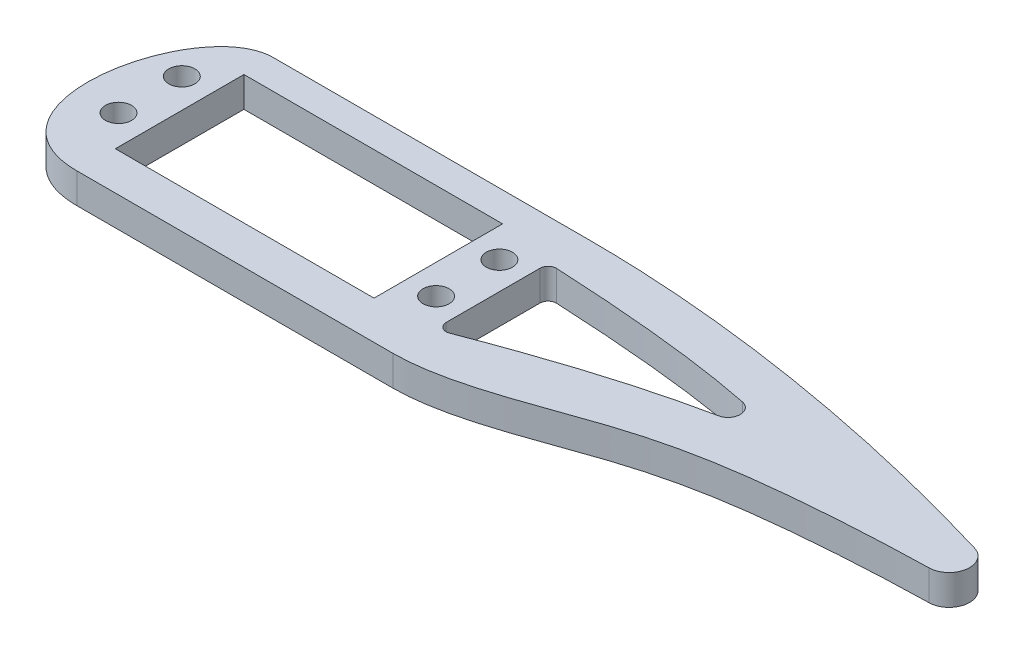
ISO-10303-21;
HEADER;
FILE_DESCRIPTION(('STEP AP214'),'2;1');
FILE_NAME('part.step','',(''),(''),'','','');
FILE_SCHEMA(('AUTOMOTIVE_DESIGN { 1 0 10303 214 1 1 1 1 }'));
ENDSEC;
DATA;
#1=APPLICATION_CONTEXT('core data for automotive mechanical design processes');
#2=APPLICATION_PROTOCOL_DEFINITION('international standard','automotive_design',2000,#1);
#3=PRODUCT_CONTEXT('',#1,'mechanical');
#4=PRODUCT('Part','Part','',(#3));
#5=PRODUCT_RELATED_PRODUCT_CATEGORY('part','',(#4));
#6=PRODUCT_DEFINITION_FORMATION('','',#4);
#7=PRODUCT_DEFINITION_CONTEXT('part definition',#1,'design');
#8=PRODUCT_DEFINITION('design','',#6,#7);
#9=PRODUCT_DEFINITION_SHAPE('','',#8);
#10=(LENGTH_UNIT() NAMED_UNIT(*) SI_UNIT(.MILLI.,.METRE.));
#11=(NAMED_UNIT(*) PLANE_ANGLE_UNIT() SI_UNIT($,.RADIAN.));
#12=(NAMED_UNIT(*) SI_UNIT($,.STERADIAN.) SOLID_ANGLE_UNIT());
#13=UNCERTAINTY_MEASURE_WITH_UNIT(LENGTH_MEASURE(1.E-05),#10,'distance_accuracy_value','');
#14=(GEOMETRIC_REPRESENTATION_CONTEXT(3) GLOBAL_UNCERTAINTY_ASSIGNED_CONTEXT((#13)) GLOBAL_UNIT_ASSIGNED_CONTEXT((#10,
#11,#12)) REPRESENTATION_CONTEXT('',''));
#15=CARTESIAN_POINT('',(0.,0.,0.));
#16=DIRECTION('',(0.,0.,1.));
#17=DIRECTION('',(1.,0.,0.));
#18=AXIS2_PLACEMENT_3D('',#15,#16,#17);
#19=CARTESIAN_POINT('',(74.0585037098222,4.699,-9.69738823326125));
#20=DIRECTION('',(0.,1.,0.));
#21=DIRECTION('',(0.,0.,1.));
#22=AXIS2_PLACEMENT_3D('',#19,#20,#21);
#23=PLANE('',#22);
#24=CARTESIAN_POINT('',(24.71166,4.699,4.92506));
#25=DIRECTION('',(0.,1.,0.));
#26=DIRECTION('',(0.,0.,1.));
#27=AXIS2_PLACEMENT_3D('',#24,#25,#26);
#28=CIRCLE('',#27,2.032);
#29=CARTESIAN_POINT('',(24.71166,4.699,6.95706));
#30=VERTEX_POINT('',#29);
#31=EDGE_CURVE('E184',#30,#30,#28,.T.);
#32=ORIENTED_EDGE('',*,*,#31,.F.);
#33=EDGE_LOOP('',(#32));
#34=FACE_BOUND('',#33,.T.);
#35=CARTESIAN_POINT('',(-24.71166,4.699,4.92506));
#36=DIRECTION('',(0.,1.,0.));
#37=DIRECTION('',(0.,0.,1.));
#38=AXIS2_PLACEMENT_3D('',#35,#36,#37);
#39=CIRCLE('',#38,2.032);
#40=CARTESIAN_POINT('',(-24.71166,4.699,6.95706));
#41=VERTEX_POINT('',#40);
#42=EDGE_CURVE('E396',#41,#41,#39,.T.);
#43=ORIENTED_EDGE('',*,*,#42,.F.);
#44=EDGE_LOOP('',(#43));
#45=FACE_BOUND('',#44,.T.);
#46=CARTESIAN_POINT('',(-24.71166,4.699,-4.92506));
#47=DIRECTION('',(0.,1.,0.));
#48=DIRECTION('',(0.,0.,1.));
#49=AXIS2_PLACEMENT_3D('',#46,#47,#48);
#50=CIRCLE('',#49,2.032);
#51=CARTESIAN_POINT('',(-24.71166,4.699,-2.89306));
#52=VERTEX_POINT('',#51);
#53=EDGE_CURVE('E395',#52,#52,#50,.T.);
#54=ORIENTED_EDGE('',*,*,#53,.F.);
#55=EDGE_LOOP('',(#54));
#56=FACE_BOUND('',#55,.T.);
#57=CARTESIAN_POINT('',(24.71166,4.699,-4.92506));
#58=DIRECTION('',(0.,1.,0.));
#59=DIRECTION('',(0.,0.,1.));
#60=AXIS2_PLACEMENT_3D('',#57,#58,#59);
#61=CIRCLE('',#60,2.032);
#62=CARTESIAN_POINT('',(24.71166,4.699,-2.89306));
#63=VERTEX_POINT('',#62);
#64=EDGE_CURVE('E385',#63,#63,#61,.T.);
#65=ORIENTED_EDGE('',*,*,#64,.F.);
#66=EDGE_LOOP('',(#65));
#67=FACE_BOUND('',#66,.T.);
#68=DIRECTION('',(1.,0.,0.));
#69=VECTOR('',#68,1.);
#70=CARTESIAN_POINT('',(0.,4.699,10.0076));
#71=LINE('',#70,#69);
#72=CARTESIAN_POINT('',(-20.1295,4.699,10.0076));
#73=VERTEX_POINT('',#72);
#74=CARTESIAN_POINT('',(20.1295,4.699,10.0076));
#75=VERTEX_POINT('',#74);
#76=EDGE_CURVE('E414',#73,#75,#71,.T.);
#77=ORIENTED_EDGE('',*,*,#76,.F.);
#78=DIRECTION('',(0.,0.,-1.));
#79=VECTOR('',#78,1.);
#80=CARTESIAN_POINT('',(-20.1295,4.699,0.));
#81=LINE('',#80,#79);
#82=CARTESIAN_POINT('',(-20.1295,4.699,-10.0076));
#83=VERTEX_POINT('',#82);
#84=EDGE_CURVE('E417',#73,#83,#81,.T.);
#85=ORIENTED_EDGE('',*,*,#84,.T.);
#86=DIRECTION('',(1.,0.,0.));
#87=VECTOR('',#86,1.);
#88=CARTESIAN_POINT('',(0.,4.699,-10.0076));
#89=LINE('',#88,#87);
#90=CARTESIAN_POINT('',(20.1295,4.699,-10.0076));
#91=VERTEX_POINT('',#90);
#92=EDGE_CURVE('E422',#83,#91,#89,.T.);
#93=ORIENTED_EDGE('',*,*,#92,.T.);
#94=DIRECTION('',(0.,0.,-1.));
#95=VECTOR('',#94,1.);
#96=CARTESIAN_POINT('',(20.1295,4.699,0.));
#97=LINE('',#96,#95);
#98=EDGE_CURVE('E419',#75,#91,#97,.T.);
#99=ORIENTED_EDGE('',*,*,#98,.F.);
#100=EDGE_LOOP('',(#77,#85,#93,#99));
#101=FACE_BOUND('',#100,.T.);
#102=CARTESIAN_POINT('',(100.540261173766,4.699,-3.04216668331225));
#103=CARTESIAN_POINT('',(92.6264968869179,4.699,-5.40617972759258));
#104=CARTESIAN_POINT('',(61.6762592813525,4.699,-14.5796));
#105=CARTESIAN_POINT('',(29.0195,4.699,-14.5796));
#106=B_SPLINE_CURVE_WITH_KNOTS('',3,(#102,#103,#104,#105),.UNSPECIFIED.,.F.,.F.,(4,4),(0.,1.),.UNSPECIFIED.);
#107=CARTESIAN_POINT('',(100.540261173766,4.699,-3.04216668331225));
#108=VERTEX_POINT('',#107);
#109=CARTESIAN_POINT('',(29.0195,4.699,-14.5796));
#110=VERTEX_POINT('',#109);
#111=EDGE_CURVE('E279',#108,#110,#106,.T.);
#112=ORIENTED_EDGE('',*,*,#111,.T.);
#113=DIRECTION('',(-1.,0.,0.));
#114=VECTOR('',#113,1.);
#115=CARTESIAN_POINT('',(-20.1295,4.699,-14.5796));
#116=LINE('',#115,#114);
#117=CARTESIAN_POINT('',(-20.1295,4.699,-14.5796));
#118=VERTEX_POINT('',#117);
#119=EDGE_CURVE('E335',#110,#118,#116,.T.);
#120=ORIENTED_EDGE('',*,*,#119,.T.);
#121=CARTESIAN_POINT('',(-20.1295,4.699,-14.5796));
#122=CARTESIAN_POINT('',(-25.650459673609,4.699,-14.5796));
#123=CARTESIAN_POINT('',(-34.7054953658274,4.699,0.225155416517888));
#124=CARTESIAN_POINT('',(-29.3834891965633,4.699,15.9766));
#125=CARTESIAN_POINT('',(-20.1295,4.699,15.9766));
#126=B_SPLINE_CURVE_WITH_KNOTS('',3,(#121,#122,#123,#124,#125),.UNSPECIFIED.,.F.,.F.,(4,1,4),
(0.,0.48487887344346,1.),.UNSPECIFIED.);
#127=CARTESIAN_POINT('',(-20.1295,4.699,15.9766));
#128=VERTEX_POINT('',#127);
#129=EDGE_CURVE('E341',#118,#128,#126,.T.);
#130=ORIENTED_EDGE('',*,*,#129,.T.);
#131=DIRECTION('',(1.,0.,0.));
#132=VECTOR('',#131,1.);
#133=CARTESIAN_POINT('',(-20.1295,4.699,15.9766));
#134=LINE('',#133,#132);
#135=CARTESIAN_POINT('',(29.0195,4.699,15.9766));
#136=VERTEX_POINT('',#135);
#137=EDGE_CURVE('E243',#128,#136,#134,.T.);
#138=ORIENTED_EDGE('',*,*,#137,.T.);
#139=CARTESIAN_POINT('',(29.0195,4.699,15.9766));
#140=CARTESIAN_POINT('',(36.7524115656265,4.699,15.9766));
#141=CARTESIAN_POINT('',(47.4487835594285,4.699,11.6621397545417));
#142=CARTESIAN_POINT('',(61.5632484959501,4.699,6.96429831302953));
#143=CARTESIAN_POINT('',(74.7544330556023,4.699,4.34444099628166));
#144=CARTESIAN_POINT('',(91.2459155465246,4.699,3.35647602826942));
#145=CARTESIAN_POINT('',(99.6999164506206,4.699,3.17426277886448));
#146=B_SPLINE_CURVE_WITH_KNOTS('',3,(#139,#140,#141,#142,#143,#144,#145),.UNSPECIFIED.,.F.,.F.,
(4,1,1,1,4),(0.,0.316402814322202,0.381996868315503,0.655940539933006,1.),.UNSPECIFIED.);
#147=CARTESIAN_POINT('',(99.6999164506206,4.699,3.17426277886448));
#148=VERTEX_POINT('',#147);
#149=EDGE_CURVE('E236',#136,#148,#146,.T.);
#150=ORIENTED_EDGE('',*,*,#149,.T.);
#151=CARTESIAN_POINT('',(99.6315,4.699,0.));
#152=DIRECTION('',(0.,1.,0.));
#153=DIRECTION('',(0.,0.,1.));
#154=AXIS2_PLACEMENT_3D('',#151,#152,#153);
#155=CIRCLE('',#154,3.17499999999999);
#156=EDGE_CURVE('E242',#148,#108,#155,.T.);
#157=ORIENTED_EDGE('',*,*,#156,.T.);
#158=EDGE_LOOP('',(#112,#120,#130,#138,#150,#157));
#159=FACE_BOUND('',#158,.T.);
#160=CARTESIAN_POINT('',(62.4205,4.699,-2.80313237722327));
#161=DIRECTION('',(0.,1.,0.));
#162=DIRECTION('',(0.,0.,1.));
#163=AXIS2_PLACEMENT_3D('',#160,#161,#162);
#164=CIRCLE('',#163,1.90500000000001);
#165=CARTESIAN_POINT('',(62.8031825476128,4.699,-4.66929932252924));
#166=VERTEX_POINT('',#165);
#167=CARTESIAN_POINT('',(62.7997826187189,4.699,-0.93627145708547));
#168=VERTEX_POINT('',#167);
#169=EDGE_CURVE('E451',#166,#168,#164,.F.);
#170=ORIENTED_EDGE('',*,*,#169,.T.);
#171=CARTESIAN_POINT('',(62.7997826187189,4.699,-0.936271457085478));
#172=CARTESIAN_POINT('',(48.0685101799294,4.699,2.05662186848359));
#173=CARTESIAN_POINT('',(29.0195,4.699,9.51793988505565));
#174=B_SPLINE_CURVE_WITH_KNOTS('',2,(#171,#172,#173),.UNSPECIFIED.,.F.,.F.,(3,3),(0.,1.),.UNSPECIFIED.);
#175=CARTESIAN_POINT('',(30.7457808389794,4.699,8.8475332411535));
#176=VERTEX_POINT('',#175);
#177=EDGE_CURVE('E169',#168,#176,#174,.T.);
#178=ORIENTED_EDGE('',*,*,#177,.T.);
#179=CARTESIAN_POINT('',(30.2895,4.699,7.66232954727627));
#180=DIRECTION('',(0.,1.,0.));
#181=DIRECTION('',(0.,0.,1.));
#182=AXIS2_PLACEMENT_3D('',#179,#180,#181);
#183=CIRCLE('',#182,1.27);
#184=CARTESIAN_POINT('',(29.0195,4.699,7.66232954727627));
#185=VERTEX_POINT('',#184);
#186=EDGE_CURVE('E305',#176,#185,#183,.F.);
#187=ORIENTED_EDGE('',*,*,#186,.T.);
#188=DIRECTION('',(0.,0.,-1.));
#189=VECTOR('',#188,1.);
#190=CARTESIAN_POINT('',(29.0195,4.699,0.));
#191=LINE('',#190,#189);
#192=CARTESIAN_POINT('',(29.0195,4.699,-6.93181674530455));
#193=VERTEX_POINT('',#192);
#194=EDGE_CURVE('E176',#185,#193,#191,.T.);
#195=ORIENTED_EDGE('',*,*,#194,.T.);
#196=CARTESIAN_POINT('',(30.2895,4.699,-6.93181674530455));
#197=DIRECTION('',(0.,1.,0.));
#198=DIRECTION('',(0.,0.,1.));
#199=AXIS2_PLACEMENT_3D('',#196,#197,#198);
#200=CIRCLE('',#199,1.27);
#201=CARTESIAN_POINT('',(30.35039297307,4.699,-8.20035608085182));
#202=VERTEX_POINT('',#201);
#203=EDGE_CURVE('E46',#193,#202,#200,.F.);
#204=ORIENTED_EDGE('',*,*,#203,.T.);
#205=CARTESIAN_POINT('',(29.0195,4.699,-8.26206011494435));
#206=CARTESIAN_POINT('',(49.8218410298351,4.699,-7.33129741222334));
#207=CARTESIAN_POINT('',(62.8031825476128,4.699,-4.66929932252922));
#208=B_SPLINE_CURVE_WITH_KNOTS('',2,(#205,#206,#207),.UNSPECIFIED.,.F.,.F.,(3,3),(0.,1.),.UNSPECIFIED.);
#209=EDGE_CURVE('E178',#202,#166,#208,.T.);
#210=ORIENTED_EDGE('',*,*,#209,.T.);
#211=EDGE_LOOP('',(#170,#178,#187,#195,#204,#210));
#212=FACE_BOUND('',#211,.T.);
#213=ADVANCED_FACE('F38',(#34,#45,#56,#67,#101,#159,#212),#23,.T.);
#214=CARTESIAN_POINT('',(74.0585037098222,0.,-9.69738823326125));
#215=DIRECTION('',(0.,1.,0.));
#216=DIRECTION('',(0.,0.,1.));
#217=AXIS2_PLACEMENT_3D('',#214,#215,#216);
#218=PLANE('',#217);
#219=CARTESIAN_POINT('',(24.71166,0.,4.92506));
#220=DIRECTION('',(0.,1.,0.));
#221=DIRECTION('',(0.,0.,1.));
#222=AXIS2_PLACEMENT_3D('',#219,#220,#221);
#223=CIRCLE('',#222,2.032);
#224=CARTESIAN_POINT('',(24.71166,0.,6.95706));
#225=VERTEX_POINT('',#224);
#226=EDGE_CURVE('E388',#225,#225,#223,.T.);
#227=ORIENTED_EDGE('',*,*,#226,.T.);
#228=EDGE_LOOP('',(#227));
#229=FACE_BOUND('',#228,.T.);
#230=CARTESIAN_POINT('',(-24.71166,0.,4.92506));
#231=DIRECTION('',(0.,1.,0.));
#232=DIRECTION('',(0.,0.,1.));
#233=AXIS2_PLACEMENT_3D('',#230,#231,#232);
#234=CIRCLE('',#233,2.032);
#235=CARTESIAN_POINT('',(-24.71166,0.,6.95706));
#236=VERTEX_POINT('',#235);
#237=EDGE_CURVE('E392',#236,#236,#234,.T.);
#238=ORIENTED_EDGE('',*,*,#237,.T.);
#239=EDGE_LOOP('',(#238));
#240=FACE_BOUND('',#239,.T.);
#241=CARTESIAN_POINT('',(-24.71166,0.,-4.92506));
#242=DIRECTION('',(0.,1.,0.));
#243=DIRECTION('',(0.,0.,1.));
#244=AXIS2_PLACEMENT_3D('',#241,#242,#243);
#245=CIRCLE('',#244,2.032);
#246=CARTESIAN_POINT('',(-24.71166,0.,-2.89306));
#247=VERTEX_POINT('',#246);
#248=EDGE_CURVE('E445',#247,#247,#245,.T.);
#249=ORIENTED_EDGE('',*,*,#248,.T.);
#250=EDGE_LOOP('',(#249));
#251=FACE_BOUND('',#250,.T.);
#252=CARTESIAN_POINT('',(100.540261173766,0.,-3.04216668331225));
#253=CARTESIAN_POINT('',(92.6264968869179,0.,-5.40617972759258));
#254=CARTESIAN_POINT('',(61.6762592813525,0.,-14.5796));
#255=CARTESIAN_POINT('',(29.0195,0.,-14.5796));
#256=B_SPLINE_CURVE_WITH_KNOTS('',3,(#252,#253,#254,#255),.UNSPECIFIED.,.F.,.F.,(4,4),(0.,1.),.UNSPECIFIED.);
#257=CARTESIAN_POINT('',(100.540261173766,0.,-3.04216668331225));
#258=VERTEX_POINT('',#257);
#259=CARTESIAN_POINT('',(29.0195,0.,-14.5796));
#260=VERTEX_POINT('',#259);
#261=EDGE_CURVE('E250',#258,#260,#256,.T.);
#262=ORIENTED_EDGE('',*,*,#261,.F.);
#263=CARTESIAN_POINT('',(99.6315,0.,0.));
#264=DIRECTION('',(0.,1.,0.));
#265=DIRECTION('',(0.,0.,1.));
#266=AXIS2_PLACEMENT_3D('',#263,#264,#265);
#267=CIRCLE('',#266,3.17499999999999);
#268=CARTESIAN_POINT('',(99.6999164506206,0.,3.17426277886448));
#269=VERTEX_POINT('',#268);
#270=EDGE_CURVE('E274',#269,#258,#267,.T.);
#271=ORIENTED_EDGE('',*,*,#270,.F.);
#272=CARTESIAN_POINT('',(29.0195,0.,15.9766));
#273=CARTESIAN_POINT('',(36.7524115656265,0.,15.9766));
#274=CARTESIAN_POINT('',(47.4487835594285,0.,11.6621397545417));
#275=CARTESIAN_POINT('',(61.5632484959501,0.,6.96429831302953));
#276=CARTESIAN_POINT('',(74.7544330556023,0.,4.34444099628166));
#277=CARTESIAN_POINT('',(91.2459155465246,0.,3.35647602826942));
#278=CARTESIAN_POINT('',(99.6999164506206,0.,3.17426277886448));
#279=B_SPLINE_CURVE_WITH_KNOTS('',3,(#272,#273,#274,#275,#276,#277,#278),.UNSPECIFIED.,.F.,.F.,
(4,1,1,1,4),(0.,0.316402814322202,0.381996868315503,0.655940539933006,1.),.UNSPECIFIED.);
#280=CARTESIAN_POINT('',(29.0195,0.,15.9766));
#281=VERTEX_POINT('',#280);
#282=EDGE_CURVE('E270',#281,#269,#279,.T.);
#283=ORIENTED_EDGE('',*,*,#282,.F.);
#284=DIRECTION('',(1.,0.,0.));
#285=VECTOR('',#284,1.);
#286=CARTESIAN_POINT('',(-20.1295,0.,15.9766));
#287=LINE('',#286,#285);
#288=CARTESIAN_POINT('',(-20.1295,0.,15.9766));
#289=VERTEX_POINT('',#288);
#290=EDGE_CURVE('E265',#289,#281,#287,.T.);
#291=ORIENTED_EDGE('',*,*,#290,.F.);
#292=CARTESIAN_POINT('',(-20.1295,0.,-14.5796));
#293=CARTESIAN_POINT('',(-25.650459673609,0.,-14.5796));
#294=CARTESIAN_POINT('',(-34.7054953658274,0.,0.225155416517888));
#295=CARTESIAN_POINT('',(-29.3834891965633,0.,15.9766));
#296=CARTESIAN_POINT('',(-20.1295,0.,15.9766));
#297=B_SPLINE_CURVE_WITH_KNOTS('',3,(#292,#293,#294,#295,#296),.UNSPECIFIED.,.F.,.F.,(4,1,4),
(0.,0.48487887344346,1.),.UNSPECIFIED.);
#298=CARTESIAN_POINT('',(-20.1295,0.,-14.5796));
#299=VERTEX_POINT('',#298);
#300=EDGE_CURVE('E261',#299,#289,#297,.T.);
#301=ORIENTED_EDGE('',*,*,#300,.F.);
#302=DIRECTION('',(-1.,0.,0.));
#303=VECTOR('',#302,1.);
#304=CARTESIAN_POINT('',(-20.1295,0.,-14.5796));
#305=LINE('',#304,#303);
#306=EDGE_CURVE('E255',#260,#299,#305,.T.);
#307=ORIENTED_EDGE('',*,*,#306,.F.);
#308=EDGE_LOOP('',(#262,#271,#283,#291,#301,#307));
#309=FACE_BOUND('',#308,.T.);
#310=DIRECTION('',(0.,0.,-1.));
#311=VECTOR('',#310,1.);
#312=CARTESIAN_POINT('',(-20.1295,0.,0.));
#313=LINE('',#312,#311);
#314=CARTESIAN_POINT('',(-20.1295,0.,10.0076));
#315=VERTEX_POINT('',#314);
#316=CARTESIAN_POINT('',(-20.1295,0.,-10.0076));
#317=VERTEX_POINT('',#316);
#318=EDGE_CURVE('E380',#315,#317,#313,.T.);
#319=ORIENTED_EDGE('',*,*,#318,.F.);
#320=DIRECTION('',(1.,0.,0.));
#321=VECTOR('',#320,1.);
#322=CARTESIAN_POINT('',(0.,0.,10.0076));
#323=LINE('',#322,#321);
#324=CARTESIAN_POINT('',(20.1295,0.,10.0076));
#325=VERTEX_POINT('',#324);
#326=EDGE_CURVE('E430',#315,#325,#323,.T.);
#327=ORIENTED_EDGE('',*,*,#326,.T.);
#328=DIRECTION('',(0.,0.,-1.));
#329=VECTOR('',#328,1.);
#330=CARTESIAN_POINT('',(20.1295,0.,0.));
#331=LINE('',#330,#329);
#332=CARTESIAN_POINT('',(20.1295,0.,-10.0076));
#333=VERTEX_POINT('',#332);
#334=EDGE_CURVE('E439',#325,#333,#331,.T.);
#335=ORIENTED_EDGE('',*,*,#334,.T.);
#336=DIRECTION('',(1.,0.,0.));
#337=VECTOR('',#336,1.);
#338=CARTESIAN_POINT('',(0.,0.,-10.0076));
#339=LINE('',#338,#337);
#340=EDGE_CURVE('E437',#317,#333,#339,.T.);
#341=ORIENTED_EDGE('',*,*,#340,.F.);
#342=EDGE_LOOP('',(#319,#327,#335,#341));
#343=FACE_BOUND('',#342,.T.);
#344=CARTESIAN_POINT('',(24.71166,0.,-4.92506));
#345=DIRECTION('',(0.,1.,0.));
#346=DIRECTION('',(0.,0.,1.));
#347=AXIS2_PLACEMENT_3D('',#344,#345,#346);
#348=CIRCLE('',#347,2.032);
#349=CARTESIAN_POINT('',(24.71166,0.,-2.89306));
#350=VERTEX_POINT('',#349);
#351=EDGE_CURVE('E383',#350,#350,#348,.T.);
#352=ORIENTED_EDGE('',*,*,#351,.T.);
#353=EDGE_LOOP('',(#352));
#354=FACE_BOUND('',#353,.T.);
#355=CARTESIAN_POINT('',(62.7997826187189,0.,-0.936271457085478));
#356=CARTESIAN_POINT('',(48.0685101799294,0.,2.05662186848359));
#357=CARTESIAN_POINT('',(29.0195,0.,9.51793988505565));
#358=B_SPLINE_CURVE_WITH_KNOTS('',2,(#355,#356,#357),.UNSPECIFIED.,.F.,.F.,(3,3),(0.,1.),.UNSPECIFIED.);
#359=CARTESIAN_POINT('',(62.7997826187189,0.,-0.93627145708547));
#360=VERTEX_POINT('',#359);
#361=CARTESIAN_POINT('',(30.7457808389794,0.,8.84753324115349));
#362=VERTEX_POINT('',#361);
#363=EDGE_CURVE('E161',#360,#362,#358,.T.);
#364=ORIENTED_EDGE('',*,*,#363,.F.);
#365=CARTESIAN_POINT('',(62.4205,0.,-2.80313237722327));
#366=DIRECTION('',(0.,1.,0.));
#367=DIRECTION('',(0.,0.,1.));
#368=AXIS2_PLACEMENT_3D('',#365,#366,#367);
#369=CIRCLE('',#368,1.90500000000001);
#370=CARTESIAN_POINT('',(62.8031825476128,0.,-4.66929932252924));
#371=VERTEX_POINT('',#370);
#372=EDGE_CURVE('E150',#371,#360,#369,.F.);
#373=ORIENTED_EDGE('',*,*,#372,.F.);
#374=CARTESIAN_POINT('',(29.0195,0.,-8.26206011494435));
#375=CARTESIAN_POINT('',(49.8218410298351,0.,-7.33129741222334));
#376=CARTESIAN_POINT('',(62.8031825476128,0.,-4.66929932252922));
#377=B_SPLINE_CURVE_WITH_KNOTS('',2,(#374,#375,#376),.UNSPECIFIED.,.F.,.F.,(3,3),(0.,1.),.UNSPECIFIED.);
#378=CARTESIAN_POINT('',(30.35039297307,0.,-8.20035608085182));
#379=VERTEX_POINT('',#378);
#380=EDGE_CURVE('E160',#379,#371,#377,.T.);
#381=ORIENTED_EDGE('',*,*,#380,.F.);
#382=CARTESIAN_POINT('',(30.2895,0.,-6.93181674530455));
#383=DIRECTION('',(0.,1.,0.));
#384=DIRECTION('',(0.,0.,1.));
#385=AXIS2_PLACEMENT_3D('',#382,#383,#384);
#386=CIRCLE('',#385,1.27);
#387=CARTESIAN_POINT('',(29.0195,0.,-6.93181674530455));
#388=VERTEX_POINT('',#387);
#389=EDGE_CURVE('E11',#379,#388,#386,.T.);
#390=ORIENTED_EDGE('',*,*,#389,.T.);
#391=DIRECTION('',(0.,0.,-1.));
#392=VECTOR('',#391,1.);
#393=CARTESIAN_POINT('',(29.0195,0.,0.));
#394=LINE('',#393,#392);
#395=CARTESIAN_POINT('',(29.0195,0.,7.66232954727627));
#396=VERTEX_POINT('',#395);
#397=EDGE_CURVE('E170',#396,#388,#394,.T.);
#398=ORIENTED_EDGE('',*,*,#397,.F.);
#399=CARTESIAN_POINT('',(30.2895,0.,7.66232954727627));
#400=DIRECTION('',(0.,1.,0.));
#401=DIRECTION('',(0.,0.,1.));
#402=AXIS2_PLACEMENT_3D('',#399,#400,#401);
#403=CIRCLE('',#402,1.27);
#404=EDGE_CURVE('E175',#396,#362,#403,.T.);
#405=ORIENTED_EDGE('',*,*,#404,.T.);
#406=EDGE_LOOP('',(#364,#373,#381,#390,#398,#405));
#407=FACE_BOUND('',#406,.T.);
#408=ADVANCED_FACE('F172',(#229,#240,#251,#309,#343,#354,#407),#218,.F.);
#409=DIRECTION('',(0.,-1.,0.));
#410=VECTOR('',#409,1.);
#411=SURFACE_OF_LINEAR_EXTRUSION('',#106,#410);
#412=ORIENTED_EDGE('',*,*,#261,.T.);
#413=DIRECTION('',(0.,-1.,0.));
#414=VECTOR('',#413,1.);
#415=CARTESIAN_POINT('',(29.0195,4.699,-14.5796));
#416=LINE('',#415,#414);
#417=EDGE_CURVE('E294',#110,#260,#416,.T.);
#418=ORIENTED_EDGE('',*,*,#417,.F.);
#419=ORIENTED_EDGE('',*,*,#111,.F.);
#420=DIRECTION('',(0.,-1.,0.));
#421=VECTOR('',#420,1.);
#422=CARTESIAN_POINT('',(100.540261173766,4.699,-3.04216668331225));
#423=LINE('',#422,#421);
#424=EDGE_CURVE('E249',#108,#258,#423,.T.);
#425=ORIENTED_EDGE('',*,*,#424,.T.);
#426=EDGE_LOOP('',(#412,#418,#419,#425));
#427=FACE_BOUND('',#426,.T.);
#428=ADVANCED_FACE('F224',(#427),#411,.F.);
#429=CARTESIAN_POINT('',(-20.1295,4.699,-14.5796));
#430=DIRECTION('',(0.,0.,1.));
#431=DIRECTION('',(1.,0.,0.));
#432=AXIS2_PLACEMENT_3D('',#429,#430,#431);
#433=PLANE('',#432);
#434=ORIENTED_EDGE('',*,*,#306,.T.);
#435=DIRECTION('',(0.,-1.,0.));
#436=VECTOR('',#435,1.);
#437=CARTESIAN_POINT('',(-20.1295,4.699,-14.5796));
#438=LINE('',#437,#436);
#439=EDGE_CURVE('E291',#118,#299,#438,.T.);
#440=ORIENTED_EDGE('',*,*,#439,.F.);
#441=ORIENTED_EDGE('',*,*,#119,.F.);
#442=ORIENTED_EDGE('',*,*,#417,.T.);
#443=EDGE_LOOP('',(#434,#440,#441,#442));
#444=FACE_BOUND('',#443,.T.);
#445=ADVANCED_FACE('F327',(#444),#433,.F.);
#446=DIRECTION('',(0.,-1.,0.));
#447=VECTOR('',#446,1.);
#448=SURFACE_OF_LINEAR_EXTRUSION('',#126,#447);
#449=ORIENTED_EDGE('',*,*,#300,.T.);
#450=DIRECTION('',(0.,-1.,0.));
#451=VECTOR('',#450,1.);
#452=CARTESIAN_POINT('',(-20.1295,4.699,15.9766));
#453=LINE('',#452,#451);
#454=EDGE_CURVE('E288',#128,#289,#453,.T.);
#455=ORIENTED_EDGE('',*,*,#454,.F.);
#456=ORIENTED_EDGE('',*,*,#129,.F.);
#457=ORIENTED_EDGE('',*,*,#439,.T.);
#458=EDGE_LOOP('',(#449,#455,#456,#457));
#459=FACE_BOUND('',#458,.T.);
#460=ADVANCED_FACE('F348',(#459),#448,.F.);
#461=CARTESIAN_POINT('',(-20.1295,4.699,15.9766));
#462=DIRECTION('',(0.,0.,-1.));
#463=DIRECTION('',(-1.,0.,0.));
#464=AXIS2_PLACEMENT_3D('',#461,#462,#463);
#465=PLANE('',#464);
#466=ORIENTED_EDGE('',*,*,#290,.T.);
#467=DIRECTION('',(0.,-1.,0.));
#468=VECTOR('',#467,1.);
#469=CARTESIAN_POINT('',(29.0195,4.699,15.9766));
#470=LINE('',#469,#468);
#471=EDGE_CURVE('E285',#136,#281,#470,.T.);
#472=ORIENTED_EDGE('',*,*,#471,.F.);
#473=ORIENTED_EDGE('',*,*,#137,.F.);
#474=ORIENTED_EDGE('',*,*,#454,.T.);
#475=EDGE_LOOP('',(#466,#472,#473,#474));
#476=FACE_BOUND('',#475,.T.);
#477=ADVANCED_FACE('F233',(#476),#465,.F.);
#478=DIRECTION('',(0.,-1.,0.));
#479=VECTOR('',#478,1.);
#480=SURFACE_OF_LINEAR_EXTRUSION('',#146,#479);
#481=ORIENTED_EDGE('',*,*,#282,.T.);
#482=DIRECTION('',(0.,-1.,0.));
#483=VECTOR('',#482,1.);
#484=CARTESIAN_POINT('',(99.6999164506206,4.699,3.17426277886448));
#485=LINE('',#484,#483);
#486=EDGE_CURVE('E282',#148,#269,#485,.T.);
#487=ORIENTED_EDGE('',*,*,#486,.F.);
#488=ORIENTED_EDGE('',*,*,#149,.F.);
#489=ORIENTED_EDGE('',*,*,#471,.T.);
#490=EDGE_LOOP('',(#481,#487,#488,#489));
#491=FACE_BOUND('',#490,.T.);
#492=ADVANCED_FACE('F228',(#491),#480,.F.);
#493=CARTESIAN_POINT('',(99.6315,4.699,0.));
#494=DIRECTION('',(0.,-1.,0.));
#495=DIRECTION('',(0.,0.,-1.));
#496=AXIS2_PLACEMENT_3D('',#493,#494,#495);
#497=CYLINDRICAL_SURFACE('',#496,3.17499999999999);
#498=ORIENTED_EDGE('',*,*,#270,.T.);
#499=ORIENTED_EDGE('',*,*,#424,.F.);
#500=ORIENTED_EDGE('',*,*,#156,.F.);
#501=ORIENTED_EDGE('',*,*,#486,.T.);
#502=EDGE_LOOP('',(#498,#499,#500,#501));
#503=FACE_BOUND('',#502,.T.);
#504=ADVANCED_FACE('F217',(#503),#497,.T.);
#505=CARTESIAN_POINT('',(0.,0.,10.0076));
#506=DIRECTION('',(0.,0.,1.));
#507=DIRECTION('',(1.,0.,0.));
#508=AXIS2_PLACEMENT_3D('',#505,#506,#507);
#509=PLANE('',#508);
#510=ORIENTED_EDGE('',*,*,#76,.T.);
#511=DIRECTION('',(0.,1.,0.));
#512=VECTOR('',#511,1.);
#513=CARTESIAN_POINT('',(20.1295,0.,10.0076));
#514=LINE('',#513,#512);
#515=EDGE_CURVE('E336',#325,#75,#514,.T.);
#516=ORIENTED_EDGE('',*,*,#515,.F.);
#517=ORIENTED_EDGE('',*,*,#326,.F.);
#518=DIRECTION('',(0.,1.,0.));
#519=VECTOR('',#518,1.);
#520=CARTESIAN_POINT('',(-20.1295,0.,10.0076));
#521=LINE('',#520,#519);
#522=EDGE_CURVE('E256',#315,#73,#521,.T.);
#523=ORIENTED_EDGE('',*,*,#522,.T.);
#524=EDGE_LOOP('',(#510,#516,#517,#523));
#525=FACE_BOUND('',#524,.T.);
#526=ADVANCED_FACE('F206',(#525),#509,.F.);
#527=CARTESIAN_POINT('',(-20.1295,0.,0.));
#528=DIRECTION('',(1.,0.,0.));
#529=DIRECTION('',(0.,0.,-1.));
#530=AXIS2_PLACEMENT_3D('',#527,#528,#529);
#531=PLANE('',#530);
#532=ORIENTED_EDGE('',*,*,#84,.F.);
#533=ORIENTED_EDGE('',*,*,#522,.F.);
#534=ORIENTED_EDGE('',*,*,#318,.T.);
#535=DIRECTION('',(0.,1.,0.));
#536=VECTOR('',#535,1.);
#537=CARTESIAN_POINT('',(-20.1295,0.,-10.0076));
#538=LINE('',#537,#536);
#539=EDGE_CURVE('E432',#317,#83,#538,.T.);
#540=ORIENTED_EDGE('',*,*,#539,.T.);
#541=EDGE_LOOP('',(#532,#533,#534,#540));
#542=FACE_BOUND('',#541,.T.);
#543=ADVANCED_FACE('F202',(#542),#531,.T.);
#544=CARTESIAN_POINT('',(0.,0.,-10.0076));
#545=DIRECTION('',(0.,0.,1.));
#546=DIRECTION('',(1.,0.,0.));
#547=AXIS2_PLACEMENT_3D('',#544,#545,#546);
#548=PLANE('',#547);
#549=ORIENTED_EDGE('',*,*,#92,.F.);
#550=ORIENTED_EDGE('',*,*,#539,.F.);
#551=ORIENTED_EDGE('',*,*,#340,.T.);
#552=DIRECTION('',(0.,1.,0.));
#553=VECTOR('',#552,1.);
#554=CARTESIAN_POINT('',(20.1295,0.,-10.0076));
#555=LINE('',#554,#553);
#556=EDGE_CURVE('E433',#333,#91,#555,.T.);
#557=ORIENTED_EDGE('',*,*,#556,.T.);
#558=EDGE_LOOP('',(#549,#550,#551,#557));
#559=FACE_BOUND('',#558,.T.);
#560=ADVANCED_FACE('F205',(#559),#548,.T.);
#561=CARTESIAN_POINT('',(20.1295,0.,0.));
#562=DIRECTION('',(1.,0.,0.));
#563=DIRECTION('',(0.,0.,-1.));
#564=AXIS2_PLACEMENT_3D('',#561,#562,#563);
#565=PLANE('',#564);
#566=ORIENTED_EDGE('',*,*,#98,.T.);
#567=ORIENTED_EDGE('',*,*,#556,.F.);
#568=ORIENTED_EDGE('',*,*,#334,.F.);
#569=ORIENTED_EDGE('',*,*,#515,.T.);
#570=EDGE_LOOP('',(#566,#567,#568,#569));
#571=FACE_BOUND('',#570,.T.);
#572=ADVANCED_FACE('F210',(#571),#565,.F.);
#573=CARTESIAN_POINT('',(24.71166,0.,-4.92506));
#574=DIRECTION('',(0.,1.,0.));
#575=DIRECTION('',(0.,0.,1.));
#576=AXIS2_PLACEMENT_3D('',#573,#574,#575);
#577=CYLINDRICAL_SURFACE('',#576,2.032);
#578=ORIENTED_EDGE('',*,*,#351,.F.);
#579=EDGE_LOOP('',(#578));
#580=FACE_BOUND('',#579,.T.);
#581=ORIENTED_EDGE('',*,*,#64,.T.);
#582=EDGE_LOOP('',(#581));
#583=FACE_BOUND('',#582,.T.);
#584=ADVANCED_FACE('F195',(#580,#583),#577,.F.);
#585=DIRECTION('',(0.,1.,0.));
#586=VECTOR('',#585,1.);
#587=SURFACE_OF_LINEAR_EXTRUSION('',#358,#586);
#588=ORIENTED_EDGE('',*,*,#363,.T.);
#589=DIRECTION('',(0.,1.,0.));
#590=VECTOR('',#589,1.);
#591=CARTESIAN_POINT('',(30.7457808389808,0.,8.84753324115295));
#592=LINE('',#591,#590);
#593=EDGE_CURVE('E297',#362,#176,#592,.T.);
#594=ORIENTED_EDGE('',*,*,#593,.T.);
#595=ORIENTED_EDGE('',*,*,#177,.F.);
#596=DIRECTION('',(0.,1.,0.));
#597=VECTOR('',#596,1.);
#598=CARTESIAN_POINT('',(62.7997826187189,0.,-0.93627145708547));
#599=LINE('',#598,#597);
#600=EDGE_CURVE('E154',#360,#168,#599,.T.);
#601=ORIENTED_EDGE('',*,*,#600,.F.);
#602=EDGE_LOOP('',(#588,#594,#595,#601));
#603=FACE_BOUND('',#602,.T.);
#604=ADVANCED_FACE('F165',(#603),#587,.T.);
#605=CARTESIAN_POINT('',(29.0195,0.,0.));
#606=DIRECTION('',(1.,0.,0.));
#607=DIRECTION('',(0.,0.,-1.));
#608=AXIS2_PLACEMENT_3D('',#605,#606,#607);
#609=PLANE('',#608);
#610=ORIENTED_EDGE('',*,*,#194,.F.);
#611=DIRECTION('',(0.,-1.,0.));
#612=VECTOR('',#611,1.);
#613=CARTESIAN_POINT('',(29.0195,0.,7.66232954727627));
#614=LINE('',#613,#612);
#615=EDGE_CURVE('E302',#185,#396,#614,.T.);
#616=ORIENTED_EDGE('',*,*,#615,.T.);
#617=ORIENTED_EDGE('',*,*,#397,.T.);
#618=DIRECTION('',(0.,-1.,0.));
#619=VECTOR('',#618,1.);
#620=CARTESIAN_POINT('',(29.0195,4.699,-6.93181674530455));
#621=LINE('',#620,#619);
#622=EDGE_CURVE('E299',#388,#193,#621,.F.);
#623=ORIENTED_EDGE('',*,*,#622,.T.);
#624=EDGE_LOOP('',(#610,#616,#617,#623));
#625=FACE_BOUND('',#624,.T.);
#626=ADVANCED_FACE('F194',(#625),#609,.T.);
#627=DIRECTION('',(0.,1.,0.));
#628=VECTOR('',#627,1.);
#629=SURFACE_OF_LINEAR_EXTRUSION('',#377,#628);
#630=ORIENTED_EDGE('',*,*,#209,.F.);
#631=DIRECTION('',(0.,1.,0.));
#632=VECTOR('',#631,1.);
#633=CARTESIAN_POINT('',(30.3503929730707,4.699,-8.20035608085178));
#634=LINE('',#633,#632);
#635=EDGE_CURVE('E53',#202,#379,#634,.F.);
#636=ORIENTED_EDGE('',*,*,#635,.T.);
#637=ORIENTED_EDGE('',*,*,#380,.T.);
#638=DIRECTION('',(0.,1.,0.));
#639=VECTOR('',#638,1.);
#640=CARTESIAN_POINT('',(62.8031825476128,0.,-4.66929932252924));
#641=LINE('',#640,#639);
#642=EDGE_CURVE('E157',#371,#166,#641,.T.);
#643=ORIENTED_EDGE('',*,*,#642,.T.);
#644=EDGE_LOOP('',(#630,#636,#637,#643));
#645=FACE_BOUND('',#644,.T.);
#646=ADVANCED_FACE('F468',(#645),#629,.T.);
#647=CARTESIAN_POINT('',(62.4205,0.,-2.80313237722327));
#648=DIRECTION('',(0.,1.,0.));
#649=DIRECTION('',(0.,0.,1.));
#650=AXIS2_PLACEMENT_3D('',#647,#648,#649);
#651=CYLINDRICAL_SURFACE('',#650,1.90500000000001);
#652=ORIENTED_EDGE('',*,*,#169,.F.);
#653=ORIENTED_EDGE('',*,*,#642,.F.);
#654=ORIENTED_EDGE('',*,*,#372,.T.);
#655=ORIENTED_EDGE('',*,*,#600,.T.);
#656=EDGE_LOOP('',(#652,#653,#654,#655));
#657=FACE_BOUND('',#656,.T.);
#658=ADVANCED_FACE('F153',(#657),#651,.F.);
#659=CARTESIAN_POINT('',(-24.71166,0.,-4.92506));
#660=DIRECTION('',(0.,1.,0.));
#661=DIRECTION('',(0.,0.,1.));
#662=AXIS2_PLACEMENT_3D('',#659,#660,#661);
#663=CYLINDRICAL_SURFACE('',#662,2.032);
#664=ORIENTED_EDGE('',*,*,#248,.F.);
#665=EDGE_LOOP('',(#664));
#666=FACE_BOUND('',#665,.T.);
#667=ORIENTED_EDGE('',*,*,#53,.T.);
#668=EDGE_LOOP('',(#667));
#669=FACE_BOUND('',#668,.T.);
#670=ADVANCED_FACE('F197',(#666,#669),#663,.F.);
#671=CARTESIAN_POINT('',(-24.71166,0.,4.92506));
#672=DIRECTION('',(0.,1.,0.));
#673=DIRECTION('',(0.,0.,1.));
#674=AXIS2_PLACEMENT_3D('',#671,#672,#673);
#675=CYLINDRICAL_SURFACE('',#674,2.032);
#676=ORIENTED_EDGE('',*,*,#237,.F.);
#677=EDGE_LOOP('',(#676));
#678=FACE_BOUND('',#677,.T.);
#679=ORIENTED_EDGE('',*,*,#42,.T.);
#680=EDGE_LOOP('',(#679));
#681=FACE_BOUND('',#680,.T.);
#682=ADVANCED_FACE('F200',(#678,#681),#675,.F.);
#683=CARTESIAN_POINT('',(24.71166,0.,4.92506));
#684=DIRECTION('',(0.,1.,0.));
#685=DIRECTION('',(0.,0.,1.));
#686=AXIS2_PLACEMENT_3D('',#683,#684,#685);
#687=CYLINDRICAL_SURFACE('',#686,2.032);
#688=ORIENTED_EDGE('',*,*,#226,.F.);
#689=EDGE_LOOP('',(#688));
#690=FACE_BOUND('',#689,.T.);
#691=ORIENTED_EDGE('',*,*,#31,.T.);
#692=EDGE_LOOP('',(#691));
#693=FACE_BOUND('',#692,.T.);
#694=ADVANCED_FACE('F315',(#690,#693),#687,.F.);
#695=CARTESIAN_POINT('',(30.2895,2.3495,7.66232954727627));
#696=DIRECTION('',(0.,1.,0.));
#697=DIRECTION('',(0.,0.,1.));
#698=AXIS2_PLACEMENT_3D('',#695,#696,#697);
#699=CYLINDRICAL_SURFACE('',#698,1.27);
#700=ORIENTED_EDGE('',*,*,#404,.F.);
#701=ORIENTED_EDGE('',*,*,#615,.F.);
#702=ORIENTED_EDGE('',*,*,#186,.F.);
#703=ORIENTED_EDGE('',*,*,#593,.F.);
#704=EDGE_LOOP('',(#700,#701,#702,#703));
#705=FACE_BOUND('',#704,.T.);
#706=ADVANCED_FACE('F313',(#705),#699,.F.);
#707=CARTESIAN_POINT('',(30.2895,2.3495,-6.93181674530455));
#708=DIRECTION('',(0.,1.,0.));
#709=DIRECTION('',(0.,0.,1.));
#710=AXIS2_PLACEMENT_3D('',#707,#708,#709);
#711=CYLINDRICAL_SURFACE('',#710,1.27);
#712=ORIENTED_EDGE('',*,*,#389,.F.);
#713=ORIENTED_EDGE('',*,*,#635,.F.);
#714=ORIENTED_EDGE('',*,*,#203,.F.);
#715=ORIENTED_EDGE('',*,*,#622,.F.);
#716=EDGE_LOOP('',(#712,#713,#714,#715));
#717=FACE_BOUND('',#716,.T.);
#718=ADVANCED_FACE('F40',(#717),#711,.F.);
#719=CLOSED_SHELL('',(#213,#408,#428,#445,#460,#477,#492,#504,#526,#543,#560,#572,#584,#604,
#626,#646,#658,#670,#682,#694,#706,#718));
#720=MANIFOLD_SOLID_BREP('B2',#719);
#721=ADVANCED_BREP_SHAPE_REPRESENTATION('',(#18,#720),#14);
#722=SHAPE_DEFINITION_REPRESENTATION(#9,#721);
ENDSEC;
END-ISO-10303-21;
